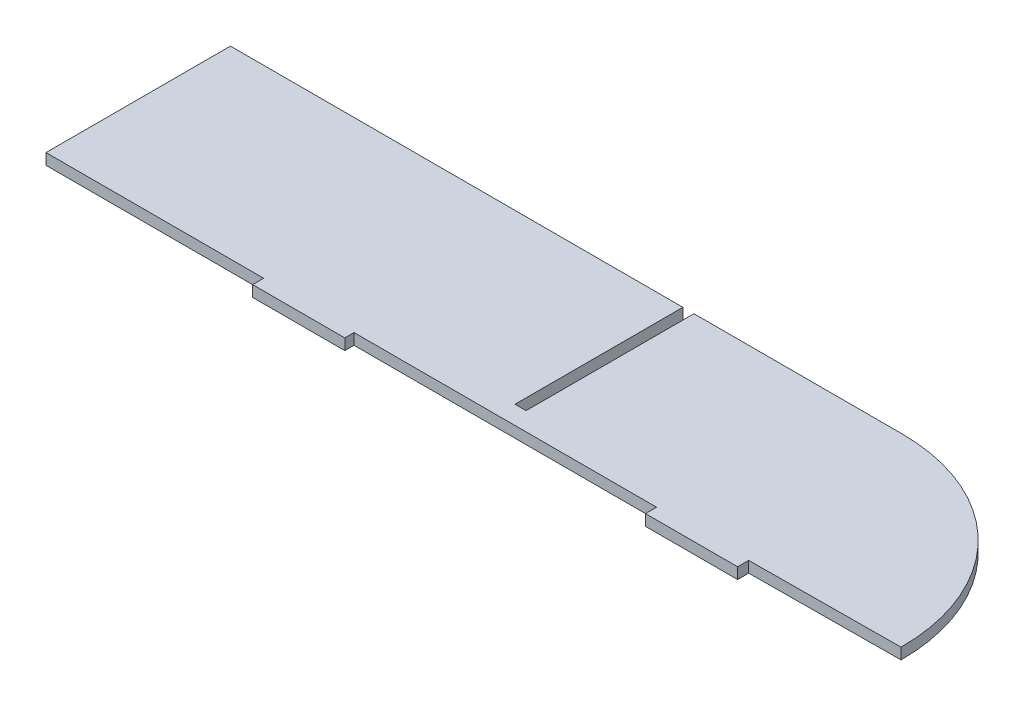
ISO-10303-21;
HEADER;
FILE_DESCRIPTION(('STEP AP214'),'2;1');
FILE_NAME('part.step','',(''),(''),'','','');
FILE_SCHEMA(('AUTOMOTIVE_DESIGN { 1 0 10303 214 1 1 1 1 }'));
ENDSEC;
DATA;
#1=APPLICATION_CONTEXT('core data for automotive mechanical design processes');
#2=APPLICATION_PROTOCOL_DEFINITION('international standard','automotive_design',2000,#1);
#3=PRODUCT_CONTEXT('',#1,'mechanical');
#4=PRODUCT('Part','Part','',(#3));
#5=PRODUCT_RELATED_PRODUCT_CATEGORY('part','',(#4));
#6=PRODUCT_DEFINITION_FORMATION('','',#4);
#7=PRODUCT_DEFINITION_CONTEXT('part definition',#1,'design');
#8=PRODUCT_DEFINITION('design','',#6,#7);
#9=PRODUCT_DEFINITION_SHAPE('','',#8);
#10=(LENGTH_UNIT() NAMED_UNIT(*) SI_UNIT(.MILLI.,.METRE.));
#11=(NAMED_UNIT(*) PLANE_ANGLE_UNIT() SI_UNIT($,.RADIAN.));
#12=(NAMED_UNIT(*) SI_UNIT($,.STERADIAN.) SOLID_ANGLE_UNIT());
#13=UNCERTAINTY_MEASURE_WITH_UNIT(LENGTH_MEASURE(1.E-05),#10,'distance_accuracy_value','');
#14=(GEOMETRIC_REPRESENTATION_CONTEXT(3) GLOBAL_UNCERTAINTY_ASSIGNED_CONTEXT((#13)) GLOBAL_UNIT_ASSIGNED_CONTEXT((#10,
#11,#12)) REPRESENTATION_CONTEXT('',''));
#15=CARTESIAN_POINT('',(0.,0.,0.));
#16=DIRECTION('',(0.,0.,1.));
#17=DIRECTION('',(1.,0.,0.));
#18=AXIS2_PLACEMENT_3D('',#15,#16,#17);
#19=CARTESIAN_POINT('',(132.,6.,240.040234188749));
#20=DIRECTION('',(0.,-1.,0.));
#21=DIRECTION('',(0.,0.,-1.));
#22=AXIS2_PLACEMENT_3D('',#19,#20,#21);
#23=CYLINDRICAL_SURFACE('',#22,100.);
#24=CARTESIAN_POINT('',(132.,0.,240.040234188749));
#25=DIRECTION('',(0.,1.,0.));
#26=DIRECTION('',(0.,0.,1.));
#27=AXIS2_PLACEMENT_3D('',#24,#25,#26);
#28=CIRCLE('',#27,100.);
#29=CARTESIAN_POINT('',(231.999056433838,0.,240.474644527213));
#30=VERTEX_POINT('',#29);
#31=CARTESIAN_POINT('',(132.,0.,140.040234188749));
#32=VERTEX_POINT('',#31);
#33=EDGE_CURVE('E177',#30,#32,#28,.T.);
#34=ORIENTED_EDGE('',*,*,#33,.T.);
#35=DIRECTION('',(0.,-1.,0.));
#36=VECTOR('',#35,1.);
#37=CARTESIAN_POINT('',(132.,6.,140.040234188749));
#38=LINE('',#37,#36);
#39=CARTESIAN_POINT('',(132.,6.,140.040234188749));
#40=VERTEX_POINT('',#39);
#41=EDGE_CURVE('E11',#40,#32,#38,.T.);
#42=ORIENTED_EDGE('',*,*,#41,.F.);
#43=CARTESIAN_POINT('',(132.,6.,240.040234188749));
#44=DIRECTION('',(0.,1.,0.));
#45=DIRECTION('',(0.,0.,1.));
#46=AXIS2_PLACEMENT_3D('',#43,#44,#45);
#47=CIRCLE('',#46,100.);
#48=CARTESIAN_POINT('',(231.999056433838,6.,240.474644527213));
#49=VERTEX_POINT('',#48);
#50=EDGE_CURVE('E207',#49,#40,#47,.T.);
#51=ORIENTED_EDGE('',*,*,#50,.F.);
#52=DIRECTION('',(0.,-1.,0.));
#53=VECTOR('',#52,1.);
#54=CARTESIAN_POINT('',(231.999056433838,6.,240.474644527213));
#55=LINE('',#54,#53);
#56=EDGE_CURVE('E173',#49,#30,#55,.T.);
#57=ORIENTED_EDGE('',*,*,#56,.T.);
#58=EDGE_LOOP('',(#34,#42,#51,#57));
#59=FACE_BOUND('',#58,.T.);
#60=ADVANCED_FACE('F33',(#59),#23,.T.);
#61=CARTESIAN_POINT('',(19.3160585979953,6.,140.040234188749));
#62=DIRECTION('',(0.,0.,1.));
#63=DIRECTION('',(1.,0.,0.));
#64=AXIS2_PLACEMENT_3D('',#61,#62,#63);
#65=PLANE('',#64);
#66=DIRECTION('',(-1.,0.,0.));
#67=VECTOR('',#66,1.);
#68=CARTESIAN_POINT('',(19.3160585979953,0.,140.040234188749));
#69=LINE('',#68,#67);
#70=CARTESIAN_POINT('',(19.3160585979953,0.,140.040234188749));
#71=VERTEX_POINT('',#70);
#72=EDGE_CURVE('E180',#32,#71,#69,.T.);
#73=ORIENTED_EDGE('',*,*,#72,.T.);
#74=DIRECTION('',(0.,-1.,0.));
#75=VECTOR('',#74,1.);
#76=CARTESIAN_POINT('',(19.3160585979953,6.,140.040234188749));
#77=LINE('',#76,#75);
#78=CARTESIAN_POINT('',(19.3160585979953,6.,140.040234188749));
#79=VERTEX_POINT('',#78);
#80=EDGE_CURVE('E41',#79,#71,#77,.T.);
#81=ORIENTED_EDGE('',*,*,#80,.F.);
#82=DIRECTION('',(-1.,0.,0.));
#83=VECTOR('',#82,1.);
#84=CARTESIAN_POINT('',(19.3160585979953,6.,140.040234188749));
#85=LINE('',#84,#83);
#86=EDGE_CURVE('E116',#40,#79,#85,.T.);
#87=ORIENTED_EDGE('',*,*,#86,.F.);
#88=ORIENTED_EDGE('',*,*,#41,.T.);
#89=EDGE_LOOP('',(#73,#81,#87,#88));
#90=FACE_BOUND('',#89,.T.);
#91=ADVANCED_FACE('F305',(#90),#65,.F.);
#92=CARTESIAN_POINT('',(19.316058597995,6.,231.04023418875));
#93=DIRECTION('',(1.,0.,0.));
#94=DIRECTION('',(0.,0.,-1.));
#95=AXIS2_PLACEMENT_3D('',#92,#93,#94);
#96=PLANE('',#95);
#97=DIRECTION('',(0.,0.,1.));
#98=VECTOR('',#97,1.);
#99=CARTESIAN_POINT('',(19.316058597995,0.,231.04023418875));
#100=LINE('',#99,#98);
#101=CARTESIAN_POINT('',(19.316058597995,0.,231.04023418875));
#102=VERTEX_POINT('',#101);
#103=EDGE_CURVE('E182',#71,#102,#100,.T.);
#104=ORIENTED_EDGE('',*,*,#103,.T.);
#105=DIRECTION('',(0.,-1.,0.));
#106=VECTOR('',#105,1.);
#107=CARTESIAN_POINT('',(19.316058597995,6.,231.04023418875));
#108=LINE('',#107,#106);
#109=CARTESIAN_POINT('',(19.316058597995,6.,231.04023418875));
#110=VERTEX_POINT('',#109);
#111=EDGE_CURVE('E238',#110,#102,#108,.T.);
#112=ORIENTED_EDGE('',*,*,#111,.F.);
#113=DIRECTION('',(0.,0.,1.));
#114=VECTOR('',#113,1.);
#115=CARTESIAN_POINT('',(19.316058597995,6.,231.04023418875));
#116=LINE('',#115,#114);
#117=EDGE_CURVE('E246',#79,#110,#116,.T.);
#118=ORIENTED_EDGE('',*,*,#117,.F.);
#119=ORIENTED_EDGE('',*,*,#80,.T.);
#120=EDGE_LOOP('',(#104,#112,#118,#119));
#121=FACE_BOUND('',#120,.T.);
#122=ADVANCED_FACE('F244',(#121),#96,.F.);
#123=CARTESIAN_POINT('',(13.316058597995,6.,231.04023418875));
#124=DIRECTION('',(0.,0.,1.));
#125=DIRECTION('',(1.,0.,0.));
#126=AXIS2_PLACEMENT_3D('',#123,#124,#125);
#127=PLANE('',#126);
#128=DIRECTION('',(-1.,0.,0.));
#129=VECTOR('',#128,1.);
#130=CARTESIAN_POINT('',(13.316058597995,0.,231.04023418875));
#131=LINE('',#130,#129);
#132=CARTESIAN_POINT('',(13.316058597995,0.,231.04023418875));
#133=VERTEX_POINT('',#132);
#134=EDGE_CURVE('E184',#102,#133,#131,.T.);
#135=ORIENTED_EDGE('',*,*,#134,.T.);
#136=DIRECTION('',(0.,-1.,0.));
#137=VECTOR('',#136,1.);
#138=CARTESIAN_POINT('',(13.316058597995,6.,231.04023418875));
#139=LINE('',#138,#137);
#140=CARTESIAN_POINT('',(13.316058597995,6.,231.04023418875));
#141=VERTEX_POINT('',#140);
#142=EDGE_CURVE('E235',#141,#133,#139,.T.);
#143=ORIENTED_EDGE('',*,*,#142,.F.);
#144=DIRECTION('',(-1.,0.,0.));
#145=VECTOR('',#144,1.);
#146=CARTESIAN_POINT('',(13.316058597995,6.,231.04023418875));
#147=LINE('',#146,#145);
#148=EDGE_CURVE('E264',#110,#141,#147,.T.);
#149=ORIENTED_EDGE('',*,*,#148,.F.);
#150=ORIENTED_EDGE('',*,*,#111,.T.);
#151=EDGE_LOOP('',(#135,#143,#149,#150));
#152=FACE_BOUND('',#151,.T.);
#153=ADVANCED_FACE('F255',(#152),#127,.F.);
#154=CARTESIAN_POINT('',(13.316058597995,6.,231.04023418875));
#155=DIRECTION('',(-1.,0.,0.));
#156=DIRECTION('',(0.,0.,1.));
#157=AXIS2_PLACEMENT_3D('',#154,#155,#156);
#158=PLANE('',#157);
#159=DIRECTION('',(0.,0.,-1.));
#160=VECTOR('',#159,1.);
#161=CARTESIAN_POINT('',(13.316058597995,0.,231.04023418875));
#162=LINE('',#161,#160);
#163=CARTESIAN_POINT('',(13.3160585979923,0.,140.04023418875));
#164=VERTEX_POINT('',#163);
#165=EDGE_CURVE('E186',#133,#164,#162,.T.);
#166=ORIENTED_EDGE('',*,*,#165,.T.);
#167=DIRECTION('',(0.,-1.,0.));
#168=VECTOR('',#167,1.);
#169=CARTESIAN_POINT('',(13.3160585979923,6.,140.04023418875));
#170=LINE('',#169,#168);
#171=CARTESIAN_POINT('',(13.3160585979923,6.,140.04023418875));
#172=VERTEX_POINT('',#171);
#173=EDGE_CURVE('E232',#172,#164,#170,.T.);
#174=ORIENTED_EDGE('',*,*,#173,.F.);
#175=DIRECTION('',(0.,0.,-1.));
#176=VECTOR('',#175,1.);
#177=CARTESIAN_POINT('',(13.316058597995,6.,231.04023418875));
#178=LINE('',#177,#176);
#179=EDGE_CURVE('E261',#141,#172,#178,.T.);
#180=ORIENTED_EDGE('',*,*,#179,.F.);
#181=ORIENTED_EDGE('',*,*,#142,.T.);
#182=EDGE_LOOP('',(#166,#174,#180,#181));
#183=FACE_BOUND('',#182,.T.);
#184=ADVANCED_FACE('F259',(#183),#158,.F.);
#185=CARTESIAN_POINT('',(-232.,6.,140.040234188749));
#186=DIRECTION('',(0.,0.,1.));
#187=DIRECTION('',(1.,0.,0.));
#188=AXIS2_PLACEMENT_3D('',#185,#186,#187);
#189=PLANE('',#188);
#190=DIRECTION('',(-1.,0.,0.));
#191=VECTOR('',#190,1.);
#192=CARTESIAN_POINT('',(-232.,0.,140.040234188749));
#193=LINE('',#192,#191);
#194=CARTESIAN_POINT('',(-232.,0.,140.040234188749));
#195=VERTEX_POINT('',#194);
#196=EDGE_CURVE('E188',#164,#195,#193,.T.);
#197=ORIENTED_EDGE('',*,*,#196,.T.);
#198=DIRECTION('',(0.,-1.,0.));
#199=VECTOR('',#198,1.);
#200=CARTESIAN_POINT('',(-232.,6.,140.040234188749));
#201=LINE('',#200,#199);
#202=CARTESIAN_POINT('',(-232.,6.,140.040234188749));
#203=VERTEX_POINT('',#202);
#204=EDGE_CURVE('E229',#203,#195,#201,.T.);
#205=ORIENTED_EDGE('',*,*,#204,.F.);
#206=DIRECTION('',(-1.,0.,0.));
#207=VECTOR('',#206,1.);
#208=CARTESIAN_POINT('',(-232.,6.,140.040234188749));
#209=LINE('',#208,#207);
#210=EDGE_CURVE('E263',#172,#203,#209,.T.);
#211=ORIENTED_EDGE('',*,*,#210,.F.);
#212=ORIENTED_EDGE('',*,*,#173,.T.);
#213=EDGE_LOOP('',(#197,#205,#211,#212));
#214=FACE_BOUND('',#213,.T.);
#215=ADVANCED_FACE('F318',(#214),#189,.F.);
#216=CARTESIAN_POINT('',(-232.,6.,140.040234188749));
#217=DIRECTION('',(1.,0.,0.));
#218=DIRECTION('',(0.,0.,-1.));
#219=AXIS2_PLACEMENT_3D('',#216,#217,#218);
#220=PLANE('',#219);
#221=DIRECTION('',(0.,0.,1.));
#222=VECTOR('',#221,1.);
#223=CARTESIAN_POINT('',(-232.,0.,140.040234188749));
#224=LINE('',#223,#222);
#225=CARTESIAN_POINT('',(-232.,0.,240.040234188749));
#226=VERTEX_POINT('',#225);
#227=EDGE_CURVE('E190',#195,#226,#224,.T.);
#228=ORIENTED_EDGE('',*,*,#227,.T.);
#229=DIRECTION('',(0.,-1.,0.));
#230=VECTOR('',#229,1.);
#231=CARTESIAN_POINT('',(-232.,6.,240.040234188749));
#232=LINE('',#231,#230);
#233=CARTESIAN_POINT('',(-232.,6.,240.040234188749));
#234=VERTEX_POINT('',#233);
#235=EDGE_CURVE('E226',#234,#226,#232,.T.);
#236=ORIENTED_EDGE('',*,*,#235,.F.);
#237=DIRECTION('',(0.,0.,1.));
#238=VECTOR('',#237,1.);
#239=CARTESIAN_POINT('',(-232.,6.,140.040234188749));
#240=LINE('',#239,#238);
#241=EDGE_CURVE('E266',#203,#234,#240,.T.);
#242=ORIENTED_EDGE('',*,*,#241,.F.);
#243=ORIENTED_EDGE('',*,*,#204,.T.);
#244=EDGE_LOOP('',(#228,#236,#242,#243));
#245=FACE_BOUND('',#244,.T.);
#246=ADVANCED_FACE('F321',(#245),#220,.F.);
#247=CARTESIAN_POINT('',(-232.,6.,240.040234188749));
#248=DIRECTION('',(0.,0.,-1.));
#249=DIRECTION('',(-1.,0.,0.));
#250=AXIS2_PLACEMENT_3D('',#247,#248,#249);
#251=PLANE('',#250);
#252=DIRECTION('',(1.,0.,0.));
#253=VECTOR('',#252,1.);
#254=CARTESIAN_POINT('',(-232.,0.,240.040234188749));
#255=LINE('',#254,#253);
#256=CARTESIAN_POINT('',(-114.,0.,240.040234188749));
#257=VERTEX_POINT('',#256);
#258=EDGE_CURVE('E192',#226,#257,#255,.T.);
#259=ORIENTED_EDGE('',*,*,#258,.T.);
#260=DIRECTION('',(0.,-1.,0.));
#261=VECTOR('',#260,1.);
#262=CARTESIAN_POINT('',(-114.,6.,240.040234188749));
#263=LINE('',#262,#261);
#264=CARTESIAN_POINT('',(-114.,6.,240.040234188749));
#265=VERTEX_POINT('',#264);
#266=EDGE_CURVE('E223',#265,#257,#263,.T.);
#267=ORIENTED_EDGE('',*,*,#266,.F.);
#268=DIRECTION('',(1.,0.,0.));
#269=VECTOR('',#268,1.);
#270=CARTESIAN_POINT('',(-232.,6.,240.040234188749));
#271=LINE('',#270,#269);
#272=EDGE_CURVE('E272',#234,#265,#271,.T.);
#273=ORIENTED_EDGE('',*,*,#272,.F.);
#274=ORIENTED_EDGE('',*,*,#235,.T.);
#275=EDGE_LOOP('',(#259,#267,#273,#274));
#276=FACE_BOUND('',#275,.T.);
#277=ADVANCED_FACE('F325',(#276),#251,.F.);
#278=CARTESIAN_POINT('',(-114.,6.,240.040234188749));
#279=DIRECTION('',(1.,0.,0.));
#280=DIRECTION('',(0.,0.,-1.));
#281=AXIS2_PLACEMENT_3D('',#278,#279,#280);
#282=PLANE('',#281);
#283=DIRECTION('',(0.,0.,1.));
#284=VECTOR('',#283,1.);
#285=CARTESIAN_POINT('',(-114.,0.,240.040234188749));
#286=LINE('',#285,#284);
#287=CARTESIAN_POINT('',(-114.,0.,246.040234188749));
#288=VERTEX_POINT('',#287);
#289=EDGE_CURVE('E194',#257,#288,#286,.T.);
#290=ORIENTED_EDGE('',*,*,#289,.T.);
#291=DIRECTION('',(0.,-1.,0.));
#292=VECTOR('',#291,1.);
#293=CARTESIAN_POINT('',(-114.,6.,246.040234188749));
#294=LINE('',#293,#292);
#295=CARTESIAN_POINT('',(-114.,6.,246.040234188749));
#296=VERTEX_POINT('',#295);
#297=EDGE_CURVE('E220',#296,#288,#294,.T.);
#298=ORIENTED_EDGE('',*,*,#297,.F.);
#299=DIRECTION('',(0.,0.,1.));
#300=VECTOR('',#299,1.);
#301=CARTESIAN_POINT('',(-114.,6.,240.040234188749));
#302=LINE('',#301,#300);
#303=EDGE_CURVE('E274',#265,#296,#302,.T.);
#304=ORIENTED_EDGE('',*,*,#303,.F.);
#305=ORIENTED_EDGE('',*,*,#266,.T.);
#306=EDGE_LOOP('',(#290,#298,#304,#305));
#307=FACE_BOUND('',#306,.T.);
#308=ADVANCED_FACE('F329',(#307),#282,.F.);
#309=CARTESIAN_POINT('',(-114.,6.,246.040234188749));
#310=DIRECTION('',(0.,0.,-1.));
#311=DIRECTION('',(-1.,0.,0.));
#312=AXIS2_PLACEMENT_3D('',#309,#310,#311);
#313=PLANE('',#312);
#314=DIRECTION('',(1.,0.,0.));
#315=VECTOR('',#314,1.);
#316=CARTESIAN_POINT('',(-114.,0.,246.040234188749));
#317=LINE('',#316,#315);
#318=CARTESIAN_POINT('',(-64.,0.,246.040234188749));
#319=VERTEX_POINT('',#318);
#320=EDGE_CURVE('E196',#288,#319,#317,.T.);
#321=ORIENTED_EDGE('',*,*,#320,.T.);
#322=DIRECTION('',(0.,-1.,0.));
#323=VECTOR('',#322,1.);
#324=CARTESIAN_POINT('',(-64.,6.,246.040234188749));
#325=LINE('',#324,#323);
#326=CARTESIAN_POINT('',(-64.,6.,246.040234188749));
#327=VERTEX_POINT('',#326);
#328=EDGE_CURVE('E217',#327,#319,#325,.T.);
#329=ORIENTED_EDGE('',*,*,#328,.F.);
#330=DIRECTION('',(1.,0.,0.));
#331=VECTOR('',#330,1.);
#332=CARTESIAN_POINT('',(-114.,6.,246.040234188749));
#333=LINE('',#332,#331);
#334=EDGE_CURVE('E276',#296,#327,#333,.T.);
#335=ORIENTED_EDGE('',*,*,#334,.F.);
#336=ORIENTED_EDGE('',*,*,#297,.T.);
#337=EDGE_LOOP('',(#321,#329,#335,#336));
#338=FACE_BOUND('',#337,.T.);
#339=ADVANCED_FACE('F333',(#338),#313,.F.);
#340=CARTESIAN_POINT('',(-64.,6.,241.040234188751));
#341=DIRECTION('',(-1.,0.,0.));
#342=DIRECTION('',(0.,0.,1.));
#343=AXIS2_PLACEMENT_3D('',#340,#341,#342);
#344=PLANE('',#343);
#345=DIRECTION('',(0.,0.,-1.));
#346=VECTOR('',#345,1.);
#347=CARTESIAN_POINT('',(-64.,0.,241.040234188751));
#348=LINE('',#347,#346);
#349=CARTESIAN_POINT('',(-64.,0.,241.040234188751));
#350=VERTEX_POINT('',#349);
#351=EDGE_CURVE('E198',#319,#350,#348,.T.);
#352=ORIENTED_EDGE('',*,*,#351,.T.);
#353=DIRECTION('',(0.,-1.,0.));
#354=VECTOR('',#353,1.);
#355=CARTESIAN_POINT('',(-64.,6.,241.040234188751));
#356=LINE('',#355,#354);
#357=CARTESIAN_POINT('',(-64.,6.,241.040234188751));
#358=VERTEX_POINT('',#357);
#359=EDGE_CURVE('E214',#358,#350,#356,.T.);
#360=ORIENTED_EDGE('',*,*,#359,.F.);
#361=DIRECTION('',(0.,0.,-1.));
#362=VECTOR('',#361,1.);
#363=CARTESIAN_POINT('',(-64.,6.,241.040234188751));
#364=LINE('',#363,#362);
#365=EDGE_CURVE('E278',#327,#358,#364,.T.);
#366=ORIENTED_EDGE('',*,*,#365,.F.);
#367=ORIENTED_EDGE('',*,*,#328,.T.);
#368=EDGE_LOOP('',(#352,#360,#366,#367));
#369=FACE_BOUND('',#368,.T.);
#370=ADVANCED_FACE('F337',(#369),#344,.F.);
#371=CARTESIAN_POINT('',(-64.,6.,241.040234188751));
#372=DIRECTION('',(0.,0.,-1.));
#373=DIRECTION('',(-1.,0.,0.));
#374=AXIS2_PLACEMENT_3D('',#371,#372,#373);
#375=PLANE('',#374);
#376=DIRECTION('',(1.,0.,0.));
#377=VECTOR('',#376,1.);
#378=CARTESIAN_POINT('',(-64.,0.,241.040234188751));
#379=LINE('',#378,#377);
#380=CARTESIAN_POINT('',(99.9999999999999,0.,241.04023418875));
#381=VERTEX_POINT('',#380);
#382=EDGE_CURVE('E200',#350,#381,#379,.T.);
#383=ORIENTED_EDGE('',*,*,#382,.T.);
#384=DIRECTION('',(0.,-1.,0.));
#385=VECTOR('',#384,1.);
#386=CARTESIAN_POINT('',(99.9999999999999,6.,241.04023418875));
#387=LINE('',#386,#385);
#388=CARTESIAN_POINT('',(99.9999999999999,6.,241.04023418875));
#389=VERTEX_POINT('',#388);
#390=EDGE_CURVE('E211',#389,#381,#387,.T.);
#391=ORIENTED_EDGE('',*,*,#390,.F.);
#392=DIRECTION('',(1.,0.,0.));
#393=VECTOR('',#392,1.);
#394=CARTESIAN_POINT('',(-64.,6.,241.040234188751));
#395=LINE('',#394,#393);
#396=EDGE_CURVE('E280',#358,#389,#395,.T.);
#397=ORIENTED_EDGE('',*,*,#396,.F.);
#398=ORIENTED_EDGE('',*,*,#359,.T.);
#399=EDGE_LOOP('',(#383,#391,#397,#398));
#400=FACE_BOUND('',#399,.T.);
#401=ADVANCED_FACE('F286',(#400),#375,.F.);
#402=CARTESIAN_POINT('',(99.9999999999999,6.,241.04023418875));
#403=DIRECTION('',(1.,0.,0.));
#404=DIRECTION('',(0.,0.,-1.));
#405=AXIS2_PLACEMENT_3D('',#402,#403,#404);
#406=PLANE('',#405);
#407=DIRECTION('',(0.,0.,1.));
#408=VECTOR('',#407,1.);
#409=CARTESIAN_POINT('',(99.9999999999999,0.,241.04023418875));
#410=LINE('',#409,#408);
#411=CARTESIAN_POINT('',(99.9999999999999,0.,247.040234188749));
#412=VERTEX_POINT('',#411);
#413=EDGE_CURVE('E202',#381,#412,#410,.T.);
#414=ORIENTED_EDGE('',*,*,#413,.T.);
#415=DIRECTION('',(0.,-1.,0.));
#416=VECTOR('',#415,1.);
#417=CARTESIAN_POINT('',(99.9999999999999,6.,247.040234188749));
#418=LINE('',#417,#416);
#419=CARTESIAN_POINT('',(99.9999999999999,6.,247.040234188749));
#420=VERTEX_POINT('',#419);
#421=EDGE_CURVE('E168',#420,#412,#418,.T.);
#422=ORIENTED_EDGE('',*,*,#421,.F.);
#423=DIRECTION('',(0.,0.,1.));
#424=VECTOR('',#423,1.);
#425=CARTESIAN_POINT('',(99.9999999999999,6.,241.04023418875));
#426=LINE('',#425,#424);
#427=EDGE_CURVE('E159',#389,#420,#426,.T.);
#428=ORIENTED_EDGE('',*,*,#427,.F.);
#429=ORIENTED_EDGE('',*,*,#390,.T.);
#430=EDGE_LOOP('',(#414,#422,#428,#429));
#431=FACE_BOUND('',#430,.T.);
#432=ADVANCED_FACE('F290',(#431),#406,.F.);
#433=CARTESIAN_POINT('',(150.,6.,247.04023418875));
#434=DIRECTION('',(0.,0.,-1.));
#435=DIRECTION('',(-1.,0.,0.));
#436=AXIS2_PLACEMENT_3D('',#433,#434,#435);
#437=PLANE('',#436);
#438=DIRECTION('',(1.,0.,0.));
#439=VECTOR('',#438,1.);
#440=CARTESIAN_POINT('',(150.,0.,247.04023418875));
#441=LINE('',#440,#439);
#442=CARTESIAN_POINT('',(150.,0.,247.04023418875));
#443=VERTEX_POINT('',#442);
#444=EDGE_CURVE('E167',#412,#443,#441,.T.);
#445=ORIENTED_EDGE('',*,*,#444,.T.);
#446=DIRECTION('',(0.,-1.,0.));
#447=VECTOR('',#446,1.);
#448=CARTESIAN_POINT('',(150.,6.,247.04023418875));
#449=LINE('',#448,#447);
#450=CARTESIAN_POINT('',(150.,6.,247.04023418875));
#451=VERTEX_POINT('',#450);
#452=EDGE_CURVE('E164',#451,#443,#449,.T.);
#453=ORIENTED_EDGE('',*,*,#452,.F.);
#454=DIRECTION('',(1.,0.,0.));
#455=VECTOR('',#454,1.);
#456=CARTESIAN_POINT('',(150.,6.,247.04023418875));
#457=LINE('',#456,#455);
#458=EDGE_CURVE('E153',#420,#451,#457,.T.);
#459=ORIENTED_EDGE('',*,*,#458,.F.);
#460=ORIENTED_EDGE('',*,*,#421,.T.);
#461=EDGE_LOOP('',(#445,#453,#459,#460));
#462=FACE_BOUND('',#461,.T.);
#463=ADVANCED_FACE('F165',(#462),#437,.F.);
#464=CARTESIAN_POINT('',(149.958626336263,6.,241.040376838783));
#465=DIRECTION('',(-0.999976224994444,0.,0.0068956106228137));
#466=DIRECTION('',(0.0068956106228137,0.,0.999976224994444));
#467=AXIS2_PLACEMENT_3D('',#464,#465,#466);
#468=PLANE('',#467);
#469=DIRECTION('',(-0.0068956106228137,0.,-0.999976224994444));
#470=VECTOR('',#469,1.);
#471=CARTESIAN_POINT('',(149.958626336263,0.,241.040376838783));
#472=LINE('',#471,#470);
#473=CARTESIAN_POINT('',(149.958626336263,0.,241.040376838783));
#474=VERTEX_POINT('',#473);
#475=EDGE_CURVE('E102',#443,#474,#472,.T.);
#476=ORIENTED_EDGE('',*,*,#475,.T.);
#477=DIRECTION('',(0.,-1.,0.));
#478=VECTOR('',#477,1.);
#479=CARTESIAN_POINT('',(149.958626336263,6.,241.040376838783));
#480=LINE('',#479,#478);
#481=CARTESIAN_POINT('',(149.958626336263,6.,241.040376838783));
#482=VERTEX_POINT('',#481);
#483=EDGE_CURVE('E169',#482,#474,#480,.T.);
#484=ORIENTED_EDGE('',*,*,#483,.F.);
#485=DIRECTION('',(-0.0068956106228137,0.,-0.999976224994444));
#486=VECTOR('',#485,1.);
#487=CARTESIAN_POINT('',(149.958626336263,6.,241.040376838783));
#488=LINE('',#487,#486);
#489=EDGE_CURVE('E157',#451,#482,#488,.T.);
#490=ORIENTED_EDGE('',*,*,#489,.F.);
#491=ORIENTED_EDGE('',*,*,#452,.T.);
#492=EDGE_LOOP('',(#476,#484,#490,#491));
#493=FACE_BOUND('',#492,.T.);
#494=ADVANCED_FACE('F171',(#493),#468,.F.);
#495=CARTESIAN_POINT('',(149.958626336263,6.,241.040376838783));
#496=DIRECTION('',(-0.00689561062281679,0.,-0.999976224994444));
#497=DIRECTION('',(-0.999976224994444,0.,0.00689561062281679));
#498=AXIS2_PLACEMENT_3D('',#495,#496,#497);
#499=PLANE('',#498);
#500=DIRECTION('',(0.999976224994444,0.,-0.00689561062281679));
#501=VECTOR('',#500,1.);
#502=CARTESIAN_POINT('',(149.958626336263,0.,241.040376838783));
#503=LINE('',#502,#501);
#504=EDGE_CURVE('E108',#474,#30,#503,.T.);
#505=ORIENTED_EDGE('',*,*,#504,.T.);
#506=ORIENTED_EDGE('',*,*,#56,.F.);
#507=DIRECTION('',(0.999976224994444,0.,-0.00689561062281679));
#508=VECTOR('',#507,1.);
#509=CARTESIAN_POINT('',(149.958626336263,6.,241.040376838783));
#510=LINE('',#509,#508);
#511=EDGE_CURVE('E49',#482,#49,#510,.T.);
#512=ORIENTED_EDGE('',*,*,#511,.F.);
#513=ORIENTED_EDGE('',*,*,#483,.T.);
#514=EDGE_LOOP('',(#505,#506,#512,#513));
#515=FACE_BOUND('',#514,.T.);
#516=ADVANCED_FACE('F294',(#515),#499,.F.);
#517=CARTESIAN_POINT('',(132.,6.,240.040234188749));
#518=DIRECTION('',(0.,1.,0.));
#519=DIRECTION('',(0.,0.,1.));
#520=AXIS2_PLACEMENT_3D('',#517,#518,#519);
#521=PLANE('',#520);
#522=ORIENTED_EDGE('',*,*,#50,.T.);
#523=ORIENTED_EDGE('',*,*,#86,.T.);
#524=ORIENTED_EDGE('',*,*,#117,.T.);
#525=ORIENTED_EDGE('',*,*,#148,.T.);
#526=ORIENTED_EDGE('',*,*,#179,.T.);
#527=ORIENTED_EDGE('',*,*,#210,.T.);
#528=ORIENTED_EDGE('',*,*,#241,.T.);
#529=ORIENTED_EDGE('',*,*,#272,.T.);
#530=ORIENTED_EDGE('',*,*,#303,.T.);
#531=ORIENTED_EDGE('',*,*,#334,.T.);
#532=ORIENTED_EDGE('',*,*,#365,.T.);
#533=ORIENTED_EDGE('',*,*,#396,.T.);
#534=ORIENTED_EDGE('',*,*,#427,.T.);
#535=ORIENTED_EDGE('',*,*,#458,.T.);
#536=ORIENTED_EDGE('',*,*,#489,.T.);
#537=ORIENTED_EDGE('',*,*,#511,.T.);
#538=EDGE_LOOP('',(#522,#523,#524,#525,#526,#527,#528,#529,#530,#531,#532,#533,#534,#535,#536,#537));
#539=FACE_BOUND('',#538,.T.);
#540=ADVANCED_FACE('F155',(#539),#521,.T.);
#541=CARTESIAN_POINT('',(132.,0.,240.040234188749));
#542=DIRECTION('',(0.,1.,0.));
#543=DIRECTION('',(0.,0.,1.));
#544=AXIS2_PLACEMENT_3D('',#541,#542,#543);
#545=PLANE('',#544);
#546=ORIENTED_EDGE('',*,*,#33,.F.);
#547=ORIENTED_EDGE('',*,*,#504,.F.);
#548=ORIENTED_EDGE('',*,*,#475,.F.);
#549=ORIENTED_EDGE('',*,*,#444,.F.);
#550=ORIENTED_EDGE('',*,*,#413,.F.);
#551=ORIENTED_EDGE('',*,*,#382,.F.);
#552=ORIENTED_EDGE('',*,*,#351,.F.);
#553=ORIENTED_EDGE('',*,*,#320,.F.);
#554=ORIENTED_EDGE('',*,*,#289,.F.);
#555=ORIENTED_EDGE('',*,*,#258,.F.);
#556=ORIENTED_EDGE('',*,*,#227,.F.);
#557=ORIENTED_EDGE('',*,*,#196,.F.);
#558=ORIENTED_EDGE('',*,*,#165,.F.);
#559=ORIENTED_EDGE('',*,*,#134,.F.);
#560=ORIENTED_EDGE('',*,*,#103,.F.);
#561=ORIENTED_EDGE('',*,*,#72,.F.);
#562=EDGE_LOOP('',(#546,#547,#548,#549,#550,#551,#552,#553,#554,#555,#556,#557,#558,#559,#560,#561));
#563=FACE_BOUND('',#562,.T.);
#564=ADVANCED_FACE('F250',(#563),#545,.F.);
#565=CLOSED_SHELL('',(#60,#91,#122,#153,#184,#215,#246,#277,#308,#339,#370,#401,#432,#463,#494,
#516,#540,#564));
#566=MANIFOLD_SOLID_BREP('B2',#565);
#567=ADVANCED_BREP_SHAPE_REPRESENTATION('',(#18,#566),#14);
#568=SHAPE_DEFINITION_REPRESENTATION(#9,#567);
ENDSEC;
END-ISO-10303-21;
